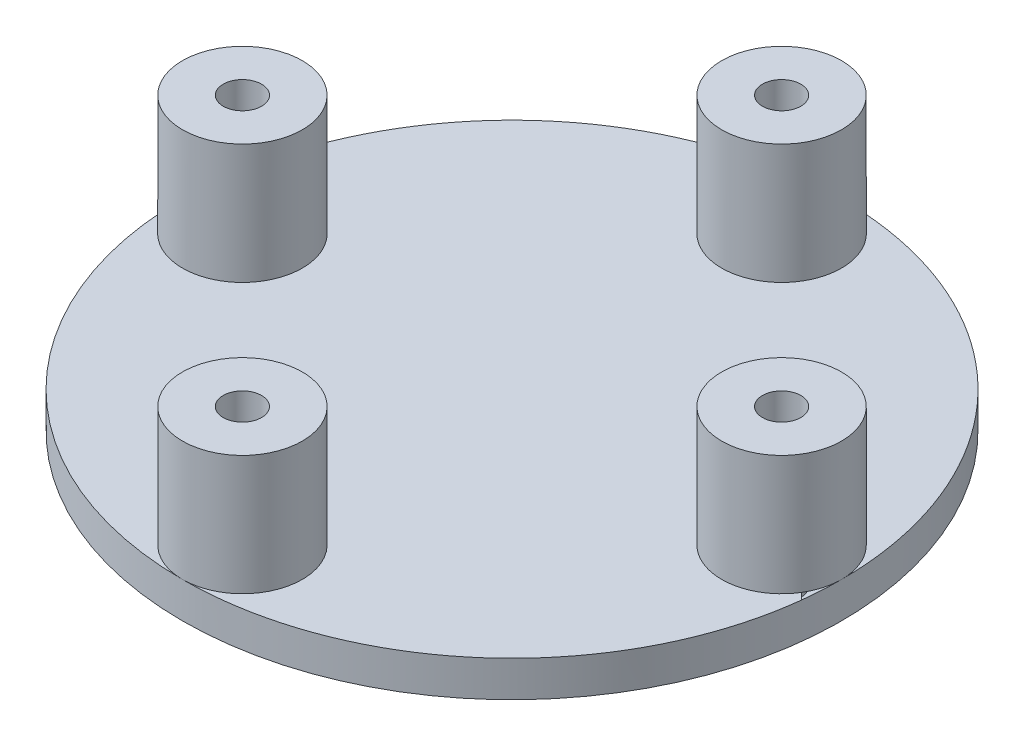
ISO-10303-21;
HEADER;
FILE_DESCRIPTION(('STEP AP214'),'2;1');
FILE_NAME('part.step','',(''),(''),'','','');
FILE_SCHEMA(('AUTOMOTIVE_DESIGN { 1 0 10303 214 1 1 1 1 }'));
ENDSEC;
DATA;
#1=APPLICATION_CONTEXT('core data for automotive mechanical design processes');
#2=APPLICATION_PROTOCOL_DEFINITION('international standard','automotive_design',2000,#1);
#3=PRODUCT_CONTEXT('',#1,'mechanical');
#4=PRODUCT('Part','Part','',(#3));
#5=PRODUCT_RELATED_PRODUCT_CATEGORY('part','',(#4));
#6=PRODUCT_DEFINITION_FORMATION('','',#4);
#7=PRODUCT_DEFINITION_CONTEXT('part definition',#1,'design');
#8=PRODUCT_DEFINITION('design','',#6,#7);
#9=PRODUCT_DEFINITION_SHAPE('','',#8);
#10=(LENGTH_UNIT() NAMED_UNIT(*) SI_UNIT(.MILLI.,.METRE.));
#11=(NAMED_UNIT(*) PLANE_ANGLE_UNIT() SI_UNIT($,.RADIAN.));
#12=(NAMED_UNIT(*) SI_UNIT($,.STERADIAN.) SOLID_ANGLE_UNIT());
#13=UNCERTAINTY_MEASURE_WITH_UNIT(LENGTH_MEASURE(1.E-05),#10,'distance_accuracy_value','');
#14=(GEOMETRIC_REPRESENTATION_CONTEXT(3) GLOBAL_UNCERTAINTY_ASSIGNED_CONTEXT((#13)) GLOBAL_UNIT_ASSIGNED_CONTEXT((#10,
#11,#12)) REPRESENTATION_CONTEXT('',''));
#15=CARTESIAN_POINT('',(0.,0.,0.));
#16=DIRECTION('',(0.,0.,1.));
#17=DIRECTION('',(1.,0.,0.));
#18=AXIS2_PLACEMENT_3D('',#15,#16,#17);
#19=CARTESIAN_POINT('',(0.,3.,0.));
#20=DIRECTION('',(0.,-1.,0.));
#21=DIRECTION('',(0.,0.,-1.));
#22=AXIS2_PLACEMENT_3D('',#19,#20,#21);
#23=CYLINDRICAL_SURFACE('',#22,27.5);
#24=CARTESIAN_POINT('',(0.,3.,0.));
#25=DIRECTION('',(0.,1.,0.));
#26=DIRECTION('',(0.,0.,1.));
#27=AXIS2_PLACEMENT_3D('',#24,#25,#26);
#28=CIRCLE('',#27,27.5);
#29=CARTESIAN_POINT('',(-1.92031473636372E-13,3.,27.5));
#30=VERTEX_POINT('',#29);
#31=CARTESIAN_POINT('',(27.5,3.,0.));
#32=VERTEX_POINT('',#31);
#33=EDGE_CURVE('E11',#30,#32,#28,.T.);
#34=ORIENTED_EDGE('',*,*,#33,.F.);
#35=CARTESIAN_POINT('',(-27.5,3.,-2.88047210454558E-13));
#36=VERTEX_POINT('',#35);
#37=EDGE_CURVE('E48',#36,#30,#28,.T.);
#38=ORIENTED_EDGE('',*,*,#37,.F.);
#39=CARTESIAN_POINT('',(0.,3.,-27.5));
#40=VERTEX_POINT('',#39);
#41=EDGE_CURVE('E64',#40,#36,#28,.T.);
#42=ORIENTED_EDGE('',*,*,#41,.F.);
#43=EDGE_CURVE('E47',#32,#40,#28,.T.);
#44=ORIENTED_EDGE('',*,*,#43,.F.);
#45=EDGE_LOOP('',(#34,#38,#42,#44));
#46=FACE_BOUND('',#45,.T.);
#47=CARTESIAN_POINT('',(0.,0.,0.));
#48=DIRECTION('',(0.,1.,0.));
#49=DIRECTION('',(0.,0.,1.));
#50=AXIS2_PLACEMENT_3D('',#47,#48,#49);
#51=CIRCLE('',#50,27.5);
#52=CARTESIAN_POINT('',(0.,0.,27.5));
#53=VERTEX_POINT('',#52);
#54=EDGE_CURVE('E42',#53,#53,#51,.T.);
#55=ORIENTED_EDGE('',*,*,#54,.T.);
#56=EDGE_LOOP('',(#55));
#57=FACE_BOUND('',#56,.T.);
#58=ADVANCED_FACE('F39',(#46,#57),#23,.T.);
#59=CARTESIAN_POINT('',(0.,3.,0.));
#60=DIRECTION('',(0.,1.,0.));
#61=DIRECTION('',(0.,0.,1.));
#62=AXIS2_PLACEMENT_3D('',#59,#60,#61);
#63=PLANE('',#62);
#64=ORIENTED_EDGE('',*,*,#43,.T.);
#65=CARTESIAN_POINT('',(0.,3.,-22.5));
#66=DIRECTION('',(0.,1.,0.));
#67=DIRECTION('',(0.,0.,1.));
#68=AXIS2_PLACEMENT_3D('',#65,#66,#67);
#69=CIRCLE('',#68,5.);
#70=EDGE_CURVE('E71',#40,#40,#69,.T.);
#71=ORIENTED_EDGE('',*,*,#70,.F.);
#72=ORIENTED_EDGE('',*,*,#41,.T.);
#73=CARTESIAN_POINT('',(-22.5,3.,-2.35674990371911E-13));
#74=DIRECTION('',(0.,1.,0.));
#75=DIRECTION('',(0.,0.,1.));
#76=AXIS2_PLACEMENT_3D('',#73,#74,#75);
#77=CIRCLE('',#76,5.);
#78=EDGE_CURVE('E69',#36,#36,#77,.T.);
#79=ORIENTED_EDGE('',*,*,#78,.F.);
#80=ORIENTED_EDGE('',*,*,#37,.T.);
#81=CARTESIAN_POINT('',(-1.57116660247941E-13,3.,22.5));
#82=DIRECTION('',(0.,1.,0.));
#83=DIRECTION('',(0.,0.,1.));
#84=AXIS2_PLACEMENT_3D('',#81,#82,#83);
#85=CIRCLE('',#84,5.);
#86=EDGE_CURVE('E85',#30,#30,#85,.T.);
#87=ORIENTED_EDGE('',*,*,#86,.F.);
#88=ORIENTED_EDGE('',*,*,#33,.T.);
#89=CARTESIAN_POINT('',(22.5,3.,0.));
#90=DIRECTION('',(0.,1.,0.));
#91=DIRECTION('',(0.,0.,1.));
#92=AXIS2_PLACEMENT_3D('',#89,#90,#91);
#93=CIRCLE('',#92,5.);
#94=EDGE_CURVE('E91',#32,#32,#93,.T.);
#95=ORIENTED_EDGE('',*,*,#94,.F.);
#96=EDGE_LOOP('',(#64,#71,#72,#79,#80,#87,#88,#95));
#97=FACE_BOUND('',#96,.T.);
#98=ADVANCED_FACE('F66',(#97),#63,.T.);
#99=CARTESIAN_POINT('',(0.,0.,0.));
#100=DIRECTION('',(0.,1.,0.));
#101=DIRECTION('',(0.,0.,1.));
#102=AXIS2_PLACEMENT_3D('',#99,#100,#101);
#103=PLANE('',#102);
#104=CARTESIAN_POINT('',(0.,0.,-22.5));
#105=DIRECTION('',(0.,1.,0.));
#106=DIRECTION('',(0.,0.,1.));
#107=AXIS2_PLACEMENT_3D('',#104,#105,#106);
#108=CIRCLE('',#107,1.6);
#109=CARTESIAN_POINT('',(0.,0.,-20.9));
#110=VERTEX_POINT('',#109);
#111=EDGE_CURVE('E80',#110,#110,#108,.T.);
#112=ORIENTED_EDGE('',*,*,#111,.T.);
#113=EDGE_LOOP('',(#112));
#114=FACE_BOUND('',#113,.T.);
#115=CARTESIAN_POINT('',(22.5,0.,0.));
#116=DIRECTION('',(0.,1.,0.));
#117=DIRECTION('',(0.,0.,1.));
#118=AXIS2_PLACEMENT_3D('',#115,#116,#117);
#119=CIRCLE('',#118,1.6);
#120=CARTESIAN_POINT('',(22.5,0.,1.60000000000008));
#121=VERTEX_POINT('',#120);
#122=EDGE_CURVE('E109',#121,#121,#119,.T.);
#123=ORIENTED_EDGE('',*,*,#122,.T.);
#124=EDGE_LOOP('',(#123));
#125=FACE_BOUND('',#124,.T.);
#126=CARTESIAN_POINT('',(-1.57116660247941E-13,0.,22.5));
#127=DIRECTION('',(0.,1.,0.));
#128=DIRECTION('',(0.,0.,1.));
#129=AXIS2_PLACEMENT_3D('',#126,#127,#128);
#130=CIRCLE('',#129,1.6);
#131=CARTESIAN_POINT('',(-1.57116660247941E-13,0.,24.1));
#132=VERTEX_POINT('',#131);
#133=EDGE_CURVE('E103',#132,#132,#130,.T.);
#134=ORIENTED_EDGE('',*,*,#133,.T.);
#135=EDGE_LOOP('',(#134));
#136=FACE_BOUND('',#135,.T.);
#137=CARTESIAN_POINT('',(-22.5,0.,-2.35674990371911E-13));
#138=DIRECTION('',(0.,1.,0.));
#139=DIRECTION('',(0.,0.,1.));
#140=AXIS2_PLACEMENT_3D('',#137,#138,#139);
#141=CIRCLE('',#140,1.6);
#142=CARTESIAN_POINT('',(-22.5,0.,1.59999999999976));
#143=VERTEX_POINT('',#142);
#144=EDGE_CURVE('E97',#143,#143,#141,.T.);
#145=ORIENTED_EDGE('',*,*,#144,.T.);
#146=EDGE_LOOP('',(#145));
#147=FACE_BOUND('',#146,.T.);
#148=ORIENTED_EDGE('',*,*,#54,.F.);
#149=EDGE_LOOP('',(#148));
#150=FACE_BOUND('',#149,.T.);
#151=ADVANCED_FACE('F121',(#114,#125,#136,#147,#150),#103,.F.);
#152=CARTESIAN_POINT('',(-22.5,13.,-2.35674990371911E-13));
#153=DIRECTION('',(0.,-1.,0.));
#154=DIRECTION('',(0.,0.,-1.));
#155=AXIS2_PLACEMENT_3D('',#152,#153,#154);
#156=CYLINDRICAL_SURFACE('',#155,5.);
#157=CARTESIAN_POINT('',(-22.5,13.,-2.35674990371911E-13));
#158=DIRECTION('',(0.,1.,0.));
#159=DIRECTION('',(0.,0.,1.));
#160=AXIS2_PLACEMENT_3D('',#157,#158,#159);
#161=CIRCLE('',#160,5.);
#162=CARTESIAN_POINT('',(-22.5,13.,4.99999999999977));
#163=VERTEX_POINT('',#162);
#164=EDGE_CURVE('E77',#163,#163,#161,.T.);
#165=ORIENTED_EDGE('',*,*,#164,.F.);
#166=EDGE_LOOP('',(#165));
#167=FACE_BOUND('',#166,.T.);
#168=ORIENTED_EDGE('',*,*,#78,.T.);
#169=EDGE_LOOP('',(#168));
#170=FACE_BOUND('',#169,.T.);
#171=ADVANCED_FACE('F159',(#167,#170),#156,.T.);
#172=CARTESIAN_POINT('',(-22.5,13.,-2.35674990371911E-13));
#173=DIRECTION('',(0.,1.,0.));
#174=DIRECTION('',(0.,0.,1.));
#175=AXIS2_PLACEMENT_3D('',#172,#173,#174);
#176=PLANE('',#175);
#177=CARTESIAN_POINT('',(-22.5,13.,-2.35674990371911E-13));
#178=DIRECTION('',(0.,1.,0.));
#179=DIRECTION('',(0.,0.,1.));
#180=AXIS2_PLACEMENT_3D('',#177,#178,#179);
#181=CIRCLE('',#180,1.6);
#182=CARTESIAN_POINT('',(-22.5,13.,1.59999999999976));
#183=VERTEX_POINT('',#182);
#184=EDGE_CURVE('E100',#183,#183,#181,.T.);
#185=ORIENTED_EDGE('',*,*,#184,.F.);
#186=EDGE_LOOP('',(#185));
#187=FACE_BOUND('',#186,.T.);
#188=ORIENTED_EDGE('',*,*,#164,.T.);
#189=EDGE_LOOP('',(#188));
#190=FACE_BOUND('',#189,.T.);
#191=ADVANCED_FACE('F161',(#187,#190),#176,.T.);
#192=CARTESIAN_POINT('',(-1.57116660247941E-13,13.,22.5));
#193=DIRECTION('',(0.,-1.,0.));
#194=DIRECTION('',(0.,0.,-1.));
#195=AXIS2_PLACEMENT_3D('',#192,#193,#194);
#196=CYLINDRICAL_SURFACE('',#195,5.);
#197=CARTESIAN_POINT('',(-1.57116660247941E-13,13.,22.5));
#198=DIRECTION('',(0.,1.,0.));
#199=DIRECTION('',(0.,0.,1.));
#200=AXIS2_PLACEMENT_3D('',#197,#198,#199);
#201=CIRCLE('',#200,5.);
#202=CARTESIAN_POINT('',(-1.57116660247941E-13,13.,27.5));
#203=VERTEX_POINT('',#202);
#204=EDGE_CURVE('E82',#203,#203,#201,.T.);
#205=ORIENTED_EDGE('',*,*,#204,.F.);
#206=EDGE_LOOP('',(#205));
#207=FACE_BOUND('',#206,.T.);
#208=ORIENTED_EDGE('',*,*,#86,.T.);
#209=EDGE_LOOP('',(#208));
#210=FACE_BOUND('',#209,.T.);
#211=ADVANCED_FACE('F164',(#207,#210),#196,.T.);
#212=CARTESIAN_POINT('',(-1.57116660247941E-13,13.,22.5));
#213=DIRECTION('',(0.,1.,0.));
#214=DIRECTION('',(0.,0.,1.));
#215=AXIS2_PLACEMENT_3D('',#212,#213,#214);
#216=PLANE('',#215);
#217=CARTESIAN_POINT('',(-1.57116660247941E-13,13.,22.5));
#218=DIRECTION('',(0.,1.,0.));
#219=DIRECTION('',(0.,0.,1.));
#220=AXIS2_PLACEMENT_3D('',#217,#218,#219);
#221=CIRCLE('',#220,1.6);
#222=CARTESIAN_POINT('',(-1.57116660247941E-13,13.,24.1));
#223=VERTEX_POINT('',#222);
#224=EDGE_CURVE('E106',#223,#223,#221,.T.);
#225=ORIENTED_EDGE('',*,*,#224,.F.);
#226=EDGE_LOOP('',(#225));
#227=FACE_BOUND('',#226,.T.);
#228=ORIENTED_EDGE('',*,*,#204,.T.);
#229=EDGE_LOOP('',(#228));
#230=FACE_BOUND('',#229,.T.);
#231=ADVANCED_FACE('F168',(#227,#230),#216,.T.);
#232=CARTESIAN_POINT('',(22.5,13.,0.));
#233=DIRECTION('',(0.,-1.,0.));
#234=DIRECTION('',(0.,0.,-1.));
#235=AXIS2_PLACEMENT_3D('',#232,#233,#234);
#236=CYLINDRICAL_SURFACE('',#235,5.);
#237=CARTESIAN_POINT('',(22.5,13.,0.));
#238=DIRECTION('',(0.,1.,0.));
#239=DIRECTION('',(0.,0.,1.));
#240=AXIS2_PLACEMENT_3D('',#237,#238,#239);
#241=CIRCLE('',#240,5.);
#242=CARTESIAN_POINT('',(22.5,13.,5.00000000000008));
#243=VERTEX_POINT('',#242);
#244=EDGE_CURVE('E88',#243,#243,#241,.T.);
#245=ORIENTED_EDGE('',*,*,#244,.F.);
#246=EDGE_LOOP('',(#245));
#247=FACE_BOUND('',#246,.T.);
#248=ORIENTED_EDGE('',*,*,#94,.T.);
#249=EDGE_LOOP('',(#248));
#250=FACE_BOUND('',#249,.T.);
#251=ADVANCED_FACE('F147',(#247,#250),#236,.T.);
#252=CARTESIAN_POINT('',(22.5,13.,0.));
#253=DIRECTION('',(0.,1.,0.));
#254=DIRECTION('',(0.,0.,1.));
#255=AXIS2_PLACEMENT_3D('',#252,#253,#254);
#256=PLANE('',#255);
#257=CARTESIAN_POINT('',(22.5,13.,0.));
#258=DIRECTION('',(0.,1.,0.));
#259=DIRECTION('',(0.,0.,1.));
#260=AXIS2_PLACEMENT_3D('',#257,#258,#259);
#261=CIRCLE('',#260,1.6);
#262=CARTESIAN_POINT('',(22.5,13.,1.60000000000008));
#263=VERTEX_POINT('',#262);
#264=EDGE_CURVE('E112',#263,#263,#261,.T.);
#265=ORIENTED_EDGE('',*,*,#264,.F.);
#266=EDGE_LOOP('',(#265));
#267=FACE_BOUND('',#266,.T.);
#268=ORIENTED_EDGE('',*,*,#244,.T.);
#269=EDGE_LOOP('',(#268));
#270=FACE_BOUND('',#269,.T.);
#271=ADVANCED_FACE('F140',(#267,#270),#256,.T.);
#272=CARTESIAN_POINT('',(0.,13.,-22.5));
#273=DIRECTION('',(0.,-1.,0.));
#274=DIRECTION('',(0.,0.,-1.));
#275=AXIS2_PLACEMENT_3D('',#272,#273,#274);
#276=CYLINDRICAL_SURFACE('',#275,5.);
#277=CARTESIAN_POINT('',(0.,13.,-22.5));
#278=DIRECTION('',(0.,1.,0.));
#279=DIRECTION('',(0.,0.,1.));
#280=AXIS2_PLACEMENT_3D('',#277,#278,#279);
#281=CIRCLE('',#280,5.);
#282=CARTESIAN_POINT('',(0.,13.,-17.5));
#283=VERTEX_POINT('',#282);
#284=EDGE_CURVE('E75',#283,#283,#281,.T.);
#285=ORIENTED_EDGE('',*,*,#284,.F.);
#286=EDGE_LOOP('',(#285));
#287=FACE_BOUND('',#286,.T.);
#288=ORIENTED_EDGE('',*,*,#70,.T.);
#289=EDGE_LOOP('',(#288));
#290=FACE_BOUND('',#289,.T.);
#291=ADVANCED_FACE('F134',(#287,#290),#276,.T.);
#292=CARTESIAN_POINT('',(0.,13.,-22.5));
#293=DIRECTION('',(0.,1.,0.));
#294=DIRECTION('',(0.,0.,1.));
#295=AXIS2_PLACEMENT_3D('',#292,#293,#294);
#296=PLANE('',#295);
#297=CARTESIAN_POINT('',(0.,13.,-22.5));
#298=DIRECTION('',(0.,1.,0.));
#299=DIRECTION('',(0.,0.,1.));
#300=AXIS2_PLACEMENT_3D('',#297,#298,#299);
#301=CIRCLE('',#300,1.6);
#302=CARTESIAN_POINT('',(0.,13.,-20.9));
#303=VERTEX_POINT('',#302);
#304=EDGE_CURVE('E115',#303,#303,#301,.T.);
#305=ORIENTED_EDGE('',*,*,#304,.F.);
#306=EDGE_LOOP('',(#305));
#307=FACE_BOUND('',#306,.T.);
#308=ORIENTED_EDGE('',*,*,#284,.T.);
#309=EDGE_LOOP('',(#308));
#310=FACE_BOUND('',#309,.T.);
#311=ADVANCED_FACE('F128',(#307,#310),#296,.T.);
#312=CARTESIAN_POINT('',(0.,0.,-22.5));
#313=DIRECTION('',(0.,1.,0.));
#314=DIRECTION('',(0.,0.,1.));
#315=AXIS2_PLACEMENT_3D('',#312,#313,#314);
#316=CYLINDRICAL_SURFACE('',#315,1.6);
#317=ORIENTED_EDGE('',*,*,#111,.F.);
#318=EDGE_LOOP('',(#317));
#319=FACE_BOUND('',#318,.T.);
#320=ORIENTED_EDGE('',*,*,#304,.T.);
#321=EDGE_LOOP('',(#320));
#322=FACE_BOUND('',#321,.T.);
#323=ADVANCED_FACE('F124',(#319,#322),#316,.F.);
#324=CARTESIAN_POINT('',(22.5,0.,0.));
#325=DIRECTION('',(0.,1.,0.));
#326=DIRECTION('',(0.,0.,1.));
#327=AXIS2_PLACEMENT_3D('',#324,#325,#326);
#328=CYLINDRICAL_SURFACE('',#327,1.6);
#329=ORIENTED_EDGE('',*,*,#122,.F.);
#330=EDGE_LOOP('',(#329));
#331=FACE_BOUND('',#330,.T.);
#332=ORIENTED_EDGE('',*,*,#264,.T.);
#333=EDGE_LOOP('',(#332));
#334=FACE_BOUND('',#333,.T.);
#335=ADVANCED_FACE('F127',(#331,#334),#328,.F.);
#336=CARTESIAN_POINT('',(-1.57116660247941E-13,0.,22.5));
#337=DIRECTION('',(0.,1.,0.));
#338=DIRECTION('',(0.,0.,1.));
#339=AXIS2_PLACEMENT_3D('',#336,#337,#338);
#340=CYLINDRICAL_SURFACE('',#339,1.6);
#341=ORIENTED_EDGE('',*,*,#133,.F.);
#342=EDGE_LOOP('',(#341));
#343=FACE_BOUND('',#342,.T.);
#344=ORIENTED_EDGE('',*,*,#224,.T.);
#345=EDGE_LOOP('',(#344));
#346=FACE_BOUND('',#345,.T.);
#347=ADVANCED_FACE('F229',(#343,#346),#340,.F.);
#348=CARTESIAN_POINT('',(-22.5,0.,-2.35674990371911E-13));
#349=DIRECTION('',(0.,1.,0.));
#350=DIRECTION('',(0.,0.,1.));
#351=AXIS2_PLACEMENT_3D('',#348,#349,#350);
#352=CYLINDRICAL_SURFACE('',#351,1.6);
#353=ORIENTED_EDGE('',*,*,#144,.F.);
#354=EDGE_LOOP('',(#353));
#355=FACE_BOUND('',#354,.T.);
#356=ORIENTED_EDGE('',*,*,#184,.T.);
#357=EDGE_LOOP('',(#356));
#358=FACE_BOUND('',#357,.T.);
#359=ADVANCED_FACE('F238',(#355,#358),#352,.F.);
#360=CLOSED_SHELL('',(#58,#98,#151,#171,#191,#211,#231,#251,#271,#291,#311,#323,#335,#347,#359));
#361=MANIFOLD_SOLID_BREP('B2',#360);
#362=ADVANCED_BREP_SHAPE_REPRESENTATION('',(#18,#361),#14);
#363=SHAPE_DEFINITION_REPRESENTATION(#9,#362);
ENDSEC;
END-ISO-10303-21;
